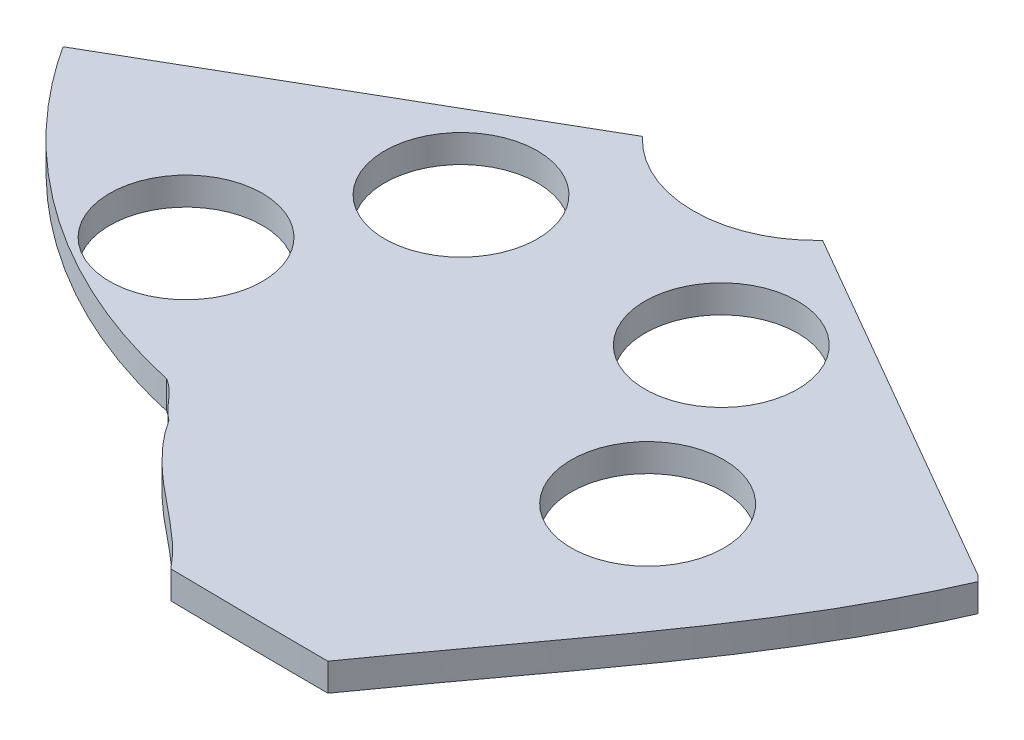
ISO-10303-21;
HEADER;
FILE_DESCRIPTION(('STEP AP214'),'2;1');
FILE_NAME('part.step','',(''),(''),'','','');
FILE_SCHEMA(('AUTOMOTIVE_DESIGN { 1 0 10303 214 1 1 1 1 }'));
ENDSEC;
DATA;
#1=APPLICATION_CONTEXT('core data for automotive mechanical design processes');
#2=APPLICATION_PROTOCOL_DEFINITION('international standard','automotive_design',2000,#1);
#3=PRODUCT_CONTEXT('',#1,'mechanical');
#4=PRODUCT('Part','Part','',(#3));
#5=PRODUCT_RELATED_PRODUCT_CATEGORY('part','',(#4));
#6=PRODUCT_DEFINITION_FORMATION('','',#4);
#7=PRODUCT_DEFINITION_CONTEXT('part definition',#1,'design');
#8=PRODUCT_DEFINITION('design','',#6,#7);
#9=PRODUCT_DEFINITION_SHAPE('','',#8);
#10=(LENGTH_UNIT() NAMED_UNIT(*) SI_UNIT(.MILLI.,.METRE.));
#11=(NAMED_UNIT(*) PLANE_ANGLE_UNIT() SI_UNIT($,.RADIAN.));
#12=(NAMED_UNIT(*) SI_UNIT($,.STERADIAN.) SOLID_ANGLE_UNIT());
#13=UNCERTAINTY_MEASURE_WITH_UNIT(LENGTH_MEASURE(1.E-05),#10,'distance_accuracy_value','');
#14=(GEOMETRIC_REPRESENTATION_CONTEXT(3) GLOBAL_UNCERTAINTY_ASSIGNED_CONTEXT((#13)) GLOBAL_UNIT_ASSIGNED_CONTEXT((#10,
#11,#12)) REPRESENTATION_CONTEXT('',''));
#15=CARTESIAN_POINT('',(0.,0.,0.));
#16=DIRECTION('',(0.,0.,1.));
#17=DIRECTION('',(1.,0.,0.));
#18=AXIS2_PLACEMENT_3D('',#15,#16,#17);
#19=CARTESIAN_POINT('',(-44.7870859446842,-67.7359999999999,64.4698967489232));
#20=DIRECTION('',(0.,-1.,0.));
#21=DIRECTION('',(0.,0.,-1.));
#22=AXIS2_PLACEMENT_3D('',#19,#20,#21);
#23=PLANE('',#22);
#24=CARTESIAN_POINT('',(18.75,-67.7359999999999,32.476));
#25=DIRECTION('',(0.,-1.,0.));
#26=DIRECTION('',(0.,0.,-1.));
#27=AXIS2_PLACEMENT_3D('',#24,#25,#26);
#28=CIRCLE('',#27,10.999845998306);
#29=CARTESIAN_POINT('',(18.75,-67.7359999999999,21.476154001694));
#30=VERTEX_POINT('',#29);
#31=EDGE_CURVE('E282',#30,#30,#28,.T.);
#32=ORIENTED_EDGE('',*,*,#31,.F.);
#33=EDGE_LOOP('',(#32));
#34=FACE_BOUND('',#33,.T.);
#35=CARTESIAN_POINT('',(-33.25,-67.7359999999999,57.591));
#36=DIRECTION('',(0.,-1.,0.));
#37=DIRECTION('',(0.,0.,-1.));
#38=AXIS2_PLACEMENT_3D('',#35,#36,#37);
#39=CIRCLE('',#38,10.999845998306);
#40=CARTESIAN_POINT('',(-33.25,-67.7359999999999,46.591154001694));
#41=VERTEX_POINT('',#40);
#42=EDGE_CURVE('E274',#41,#41,#39,.T.);
#43=ORIENTED_EDGE('',*,*,#42,.F.);
#44=EDGE_LOOP('',(#43));
#45=FACE_BOUND('',#44,.T.);
#46=CARTESIAN_POINT('',(-65.8942438215735,-67.7359999999999,42.6629141284689));
#47=CARTESIAN_POINT('',(-64.5103730944048,-67.7359999999999,44.7995838107321));
#48=CARTESIAN_POINT('',(-63.0231124482656,-67.7359999999999,46.870228375832));
#49=CARTESIAN_POINT('',(-59.8564174991639,-67.7359999999999,50.8527736003913));
#50=CARTESIAN_POINT('',(-58.1747067025662,-67.7359999999999,52.7674581947289));
#51=CARTESIAN_POINT('',(-52.8635790878858,-67.7359999999999,58.2541035728022));
#52=CARTESIAN_POINT('',(-48.9678495006857,-67.7359999999999,61.5656943039546));
#53=CARTESIAN_POINT('',(-40.6063223886827,-67.7359999999999,67.3740991938918));
#54=CARTESIAN_POINT('',(-36.1442743175034,-67.7359999999999,69.8695186681402));
#55=CARTESIAN_POINT('',(-26.815950297381,-67.7359999999999,73.9527834745407));
#56=CARTESIAN_POINT('',(-21.9559096805272,-67.7359999999999,75.5386255900114));
#57=CARTESIAN_POINT('',(-16.9859147236693,-67.7359999999999,76.6399162961217));
#58=B_SPLINE_CURVE_WITH_KNOTS('',3,(#46,#47,#48,#49,#50,#51,#52,#53,#54,#55,#56,#57),
.UNSPECIFIED.,.F.,.F.,(4,2,2,2,2,4),(1.33283993930533E-06,0.12500133283994,0.250001332839939,
0.50000133283994,0.75000133283994,1.),.UNSPECIFIED.);
#59=CARTESIAN_POINT('',(-16.9859147226186,-67.7359999999999,76.6399162913771));
#60=VERTEX_POINT('',#59);
#61=CARTESIAN_POINT('',(-65.8942438215735,-67.7359999999999,42.6629141284689));
#62=VERTEX_POINT('',#61);
#63=EDGE_CURVE('E446',#60,#62,#58,.F.);
#64=ORIENTED_EDGE('',*,*,#63,.T.);
#65=DIRECTION('',(0.866025113443951,0.,-0.500000502884139));
#66=VECTOR('',#65,1.);
#67=CARTESIAN_POINT('',(-65.8942438215735,-67.7359999999999,42.6629141284689));
#68=LINE('',#67,#66);
#69=CARTESIAN_POINT('',(-12.9766531358799,-67.7359999999999,12.1108879302399));
#70=VERTEX_POINT('',#69);
#71=EDGE_CURVE('E100',#62,#70,#68,.T.);
#72=ORIENTED_EDGE('',*,*,#71,.T.);
#73=CARTESIAN_POINT('',(0.,-67.7359999999999,0.));
#74=DIRECTION('',(0.,1.,0.));
#75=DIRECTION('',(0.,0.,-1.));
#76=AXIS2_PLACEMENT_3D('',#73,#74,#75);
#77=CIRCLE('',#76,17.7501305084715);
#78=CARTESIAN_POINT('',(12.9766531358511,-67.7359999999999,12.1108879302707));
#79=VERTEX_POINT('',#78);
#80=EDGE_CURVE('E263',#70,#79,#77,.T.);
#81=ORIENTED_EDGE('',*,*,#80,.T.);
#82=DIRECTION('',(0.866025113442778,0.,0.500000502886171));
#83=VECTOR('',#82,1.);
#84=CARTESIAN_POINT('',(12.9766531358511,-67.7359999999999,12.1108879302707));
#85=LINE('',#84,#83);
#86=CARTESIAN_POINT('',(65.8946490574661,-67.7359999999999,42.6631480920473));
#87=VERTEX_POINT('',#86);
#88=EDGE_CURVE('E257',#79,#87,#85,.T.);
#89=ORIENTED_EDGE('',*,*,#88,.T.);
#90=CARTESIAN_POINT('',(65.8946490574661,-67.7359999999999,42.6631480920473));
#91=CARTESIAN_POINT('',(66.1801065532165,-67.7359999999999,42.9413194010533));
#92=CARTESIAN_POINT('',(66.4632642301554,-67.7359999999999,43.2171523680039));
#93=CARTESIAN_POINT('',(66.7440215109314,-67.7359999999999,43.4907675784971));
#94=B_SPLINE_CURVE_WITH_KNOTS('',3,(#90,#91,#92,#93),.UNSPECIFIED.,.F.,.F.,(4,4),(0.,1.),.UNSPECIFIED.);
#95=CARTESIAN_POINT('',(66.7440215109314,-67.7359999999999,43.4907675784971));
#96=VERTEX_POINT('',#95);
#97=EDGE_CURVE('E232',#87,#96,#94,.T.);
#98=ORIENTED_EDGE('',*,*,#97,.T.);
#99=CARTESIAN_POINT('',(29.8437188807736,-67.7359999999999,100.248180586053));
#100=CARTESIAN_POINT('',(30.1403157004749,-67.7359999999999,99.828753181787));
#101=CARTESIAN_POINT('',(30.7407716473284,-67.7359999999999,98.9796285033145));
#102=CARTESIAN_POINT('',(31.8950181511044,-67.7359999999999,97.3589950207622));
#103=CARTESIAN_POINT('',(33.3461533176625,-67.7359999999999,95.3359010656423));
#104=CARTESIAN_POINT('',(35.6489327857828,-67.7359999999999,92.1550725160265));
#105=CARTESIAN_POINT('',(38.5688040539188,-67.7359999999999,88.1694898692489));
#106=CARTESIAN_POINT('',(41.480018200969,-67.7359999999999,84.2173305936617));
#107=CARTESIAN_POINT('',(43.8012890419734,-67.7359999999999,81.0499362964952));
#108=CARTESIAN_POINT('',(46.1124853023285,-67.7359999999999,77.8754755571248));
#109=CARTESIAN_POINT('',(48.9727685695331,-67.7359999999999,73.8886600115439));
#110=CARTESIAN_POINT('',(52.3273357815191,-67.7359999999999,69.0532698478011));
#111=CARTESIAN_POINT('',(55.0401692188045,-67.7359999999999,64.9503059498742));
#112=CARTESIAN_POINT('',(57.1307702870454,-67.7359999999999,61.6353610691958));
#113=CARTESIAN_POINT('',(58.6653179713874,-67.7359999999999,59.114608423476));
#114=CARTESIAN_POINT('',(60.1422061459481,-67.7359999999999,56.592290953136));
#115=CARTESIAN_POINT('',(61.280598216444,-67.7359999999999,54.5621578646775));
#116=CARTESIAN_POINT('',(62.0919371809747,-67.7359999999999,53.0676951689367));
#117=CARTESIAN_POINT('',(62.6069171423795,-67.7359999999999,52.101405018029));
#118=CARTESIAN_POINT('',(63.1112142660139,-67.7359999999999,51.1368352527422));
#119=CARTESIAN_POINT('',(63.6046687912201,-67.7359999999999,50.174087458305));
#120=CARTESIAN_POINT('',(64.0871307052581,-67.7359999999999,49.2132579069561));
#121=CARTESIAN_POINT('',(64.5584710311557,-67.7359999999999,48.2544417907281));
#122=CARTESIAN_POINT('',(65.0185540094539,-67.7359999999999,47.2977214719384));
#123=CARTESIAN_POINT('',(65.4673349282958,-67.7359999999999,46.3432084067217));
#124=CARTESIAN_POINT('',(65.9044989688588,-67.7359999999999,45.3908872480931));
#125=CARTESIAN_POINT('',(66.3307956340191,-67.7359999999999,44.4411917795238));
#126=CARTESIAN_POINT('',(66.6065853916122,-67.7359999999999,43.8068722347587));
#127=CARTESIAN_POINT('',(66.7440215218718,-67.7359999999999,43.4907675891717));
#128=B_SPLINE_CURVE_WITH_KNOTS('',3,(#99,#100,#101,#102,#103,#104,#105,#106,#107,#108,#109,#110,
#111,#112,#113,#114,#115,#116,#117,#118,#119,#120,#121,#122,#123,#124,#125,#126,#127),
.UNSPECIFIED.,.F.,.F.,(4,1,1,1,1,1,1,1,1,1,1,1,1,1,1,1,1,1,1,1,1,1,1,1,1,1,4),(0.,
0.0227157028356554,0.0459876099425524,0.0879819245551136,0.13281001264998,0.219632921638901,
0.306457076403063,0.349868689179429,0.393279780913662,0.480093699810902,0.566836641967887,
0.653501674848487,0.697571248401288,0.740132527495501,0.783992907878297,0.826813718170624,
0.843047956754735,0.859187815372855,0.875231666227044,0.891178118299632,0.907025976411927,
0.922774239928346,0.938422100991825,0.953968942316556,0.969414337866838,0.984758045107651,1.),.UNSPECIFIED.);
#129=CARTESIAN_POINT('',(29.8437188807736,-67.7359999999999,100.248180586053));
#130=VERTEX_POINT('',#129);
#131=EDGE_CURVE('E123',#96,#130,#128,.F.);
#132=ORIENTED_EDGE('',*,*,#131,.T.);
#133=CARTESIAN_POINT('',(29.8437548988785,-67.7359999999999,100.248180387592));
#134=CARTESIAN_POINT('',(22.6769169848528,-67.7359999999999,100.287743676472));
#135=CARTESIAN_POINT('',(15.0122740911258,-67.7359999999999,100.114292594177));
#136=CARTESIAN_POINT('',(7.01359173730503,-67.7359999999999,100.036279356633));
#137=B_SPLINE_CURVE_WITH_KNOTS('',3,(#133,#134,#135,#136),.UNSPECIFIED.,.F.,.F.,(4,4),(0.,1.),.UNSPECIFIED.);
#138=CARTESIAN_POINT('',(7.01359173730503,-67.7359999999999,100.036279356633));
#139=VERTEX_POINT('',#138);
#140=EDGE_CURVE('E116',#130,#139,#137,.T.);
#141=ORIENTED_EDGE('',*,*,#140,.T.);
#142=CARTESIAN_POINT('',(-11.6293824871223,-67.736,81.6755992516973));
#143=CARTESIAN_POINT('',(-11.5737425995266,-67.736,81.7629343796846));
#144=CARTESIAN_POINT('',(-11.3131403871373,-67.736,82.1719907333923));
#145=CARTESIAN_POINT('',(-10.8110290264511,-67.7359999999999,82.9062930253016));
#146=CARTESIAN_POINT('',(-9.87531122790049,-67.7359999999999,84.1601083605932));
#147=CARTESIAN_POINT('',(-8.61160455603236,-67.7359999999999,85.6579236494982));
#148=CARTESIAN_POINT('',(-7.26548228353772,-67.7359999999999,87.0577824462961));
#149=CARTESIAN_POINT('',(-6.14778207271069,-67.7359999999999,88.1319112799531));
#150=CARTESIAN_POINT('',(-5.00507725374255,-67.7359999999999,89.1807237276031));
#151=CARTESIAN_POINT('',(-3.53694203129043,-67.7359999999999,90.4508476372666));
#152=CARTESIAN_POINT('',(-1.73709072592609,-67.7359999999999,91.9325947296244));
#153=CARTESIAN_POINT('',(0.0754397038429127,-67.7359999999999,93.4005965514735));
#154=CARTESIAN_POINT('',(1.87248135152671,-67.7359999999999,94.8852674683476));
#155=CARTESIAN_POINT('',(3.44759358913644,-67.7359999999999,96.266119679191));
#156=CARTESIAN_POINT('',(4.77398734546979,-67.7359999999999,97.5326759971414));
#157=CARTESIAN_POINT('',(5.84838835133482,-67.7359999999999,98.6535488318008));
#158=CARTESIAN_POINT('',(6.57792395724219,-67.7359999999999,99.4934942826784));
#159=CARTESIAN_POINT('',(6.95051888800939,-67.7359999999999,99.9577107190432));
#160=CARTESIAN_POINT('',(7.01358496649672,-67.7359999999999,100.036284791102));
#161=B_SPLINE_CURVE_WITH_KNOTS('',3,(#142,#143,#144,#145,#146,#147,#148,#149,#150,#151,#152,
#153,#154,#155,#156,#157,#158,#159,#160),.UNSPECIFIED.,.F.,.F.,(4,1,1,1,1,1,1,1,1,1,1,1,1,1,1,1,
4),(-2.70658933265722E-07,0.0118277018035376,0.055398969802556,0.101565598992885,
0.190484555528971,0.279022579901435,0.323268635205543,0.367534249622184,0.456173794315668,
0.544964249444377,0.633814620759511,0.722591773003938,0.811206246834848,0.873007032070253,
0.932013626831285,0.988495942236272,1.00000413375592),.UNSPECIFIED.);
#162=CARTESIAN_POINT('',(-11.6293824871223,-67.7359999999999,81.6755992516973));
#163=VERTEX_POINT('',#162);
#164=EDGE_CURVE('E120',#139,#163,#161,.F.);
#165=ORIENTED_EDGE('',*,*,#164,.T.);
#166=CARTESIAN_POINT('',(-16.9859147226186,-67.7359999999999,76.6399162913771));
#167=CARTESIAN_POINT('',(-16.92412669874,-67.7359999999999,76.6790819043911));
#168=CARTESIAN_POINT('',(-16.8063461718812,-67.7359999999999,76.7537395199929));
#169=CARTESIAN_POINT('',(-16.5611305774708,-67.7359999999999,76.9182426639113));
#170=CARTESIAN_POINT('',(-16.1291727934494,-67.7359999999999,77.2295637088581));
#171=CARTESIAN_POINT('',(-15.532992148909,-67.7359999999999,77.7288547684759));
#172=CARTESIAN_POINT('',(-14.8712605942748,-67.7359999999999,78.386841510728));
#173=CARTESIAN_POINT('',(-14.3515919393694,-67.7359999999999,78.9665925946479));
#174=CARTESIAN_POINT('',(-13.9410660004133,-67.7359999999999,79.4367046744693));
#175=CARTESIAN_POINT('',(-13.5290741447922,-67.7359999999999,79.9062752961094));
#176=CARTESIAN_POINT('',(-13.0027447575765,-67.7359999999999,80.4827028740064));
#177=CARTESIAN_POINT('',(-12.4400262300641,-67.7359999999999,81.0241130975552));
#178=CARTESIAN_POINT('',(-12.0314414154114,-67.7359999999999,81.3674007983877));
#179=CARTESIAN_POINT('',(-11.7995239402494,-67.7359999999999,81.5492448039049));
#180=CARTESIAN_POINT('',(-11.6880222397685,-67.7359999999999,81.6320514661815));
#181=CARTESIAN_POINT('',(-11.6293824871226,-67.7359999999999,81.6755992516976));
#182=B_SPLINE_CURVE_WITH_KNOTS('',3,(#166,#167,#168,#169,#170,#171,#172,#173,#174,#175,#176,
#177,#178,#179,#180,#181),.UNSPECIFIED.,.F.,.F.,(4,1,1,1,1,1,1,1,1,1,1,1,1,4),
(2.34221490162945E-05,0.0297735146203462,0.0567331426646225,0.120099842966942,0.246240096109832,
0.37248646038271,0.499289156751347,0.56280346873172,0.626315954972162,0.753343786552148,
0.880157282408044,0.943518910088665,0.97029632693346,1.),.UNSPECIFIED.);
#183=EDGE_CURVE('E51',#163,#60,#182,.F.);
#184=ORIENTED_EDGE('',*,*,#183,.T.);
#185=EDGE_LOOP('',(#64,#72,#81,#89,#98,#132,#141,#165,#184));
#186=FACE_BOUND('',#185,.T.);
#187=CARTESIAN_POINT('',(33.25,-67.7359999999999,57.591));
#188=DIRECTION('',(0.,-1.,0.));
#189=DIRECTION('',(0.,0.,-1.));
#190=AXIS2_PLACEMENT_3D('',#187,#188,#189);
#191=CIRCLE('',#190,10.999845998306);
#192=CARTESIAN_POINT('',(33.25,-67.7359999999999,46.591154001694));
#193=VERTEX_POINT('',#192);
#194=EDGE_CURVE('E275',#193,#193,#191,.T.);
#195=ORIENTED_EDGE('',*,*,#194,.F.);
#196=EDGE_LOOP('',(#195));
#197=FACE_BOUND('',#196,.T.);
#198=CARTESIAN_POINT('',(-18.75,-67.7359999999999,32.476));
#199=DIRECTION('',(0.,-1.,0.));
#200=DIRECTION('',(0.,0.,-1.));
#201=AXIS2_PLACEMENT_3D('',#198,#199,#200);
#202=CIRCLE('',#201,10.999845998306);
#203=CARTESIAN_POINT('',(-18.75,-67.7359999999999,21.476154001694));
#204=VERTEX_POINT('',#203);
#205=EDGE_CURVE('E288',#204,#204,#202,.T.);
#206=ORIENTED_EDGE('',*,*,#205,.F.);
#207=EDGE_LOOP('',(#206));
#208=FACE_BOUND('',#207,.T.);
#209=ADVANCED_FACE('F30',(#34,#45,#186,#197,#208),#23,.T.);
#210=CARTESIAN_POINT('',(-44.7870859446842,-63.7359999999999,64.4698967489232));
#211=DIRECTION('',(0.,-1.,0.));
#212=DIRECTION('',(0.,0.,-1.));
#213=AXIS2_PLACEMENT_3D('',#210,#211,#212);
#214=PLANE('',#213);
#215=CARTESIAN_POINT('',(18.75,-63.7359999999999,32.476));
#216=DIRECTION('',(0.,-1.,0.));
#217=DIRECTION('',(0.,0.,-1.));
#218=AXIS2_PLACEMENT_3D('',#215,#216,#217);
#219=CIRCLE('',#218,10.999845998306);
#220=CARTESIAN_POINT('',(18.75,-63.7359999999999,21.476154001694));
#221=VERTEX_POINT('',#220);
#222=EDGE_CURVE('E285',#221,#221,#219,.T.);
#223=ORIENTED_EDGE('',*,*,#222,.T.);
#224=EDGE_LOOP('',(#223));
#225=FACE_BOUND('',#224,.T.);
#226=CARTESIAN_POINT('',(-33.25,-63.7359999999999,57.591));
#227=DIRECTION('',(0.,-1.,0.));
#228=DIRECTION('',(0.,0.,-1.));
#229=AXIS2_PLACEMENT_3D('',#226,#227,#228);
#230=CIRCLE('',#229,10.999845998306);
#231=CARTESIAN_POINT('',(-33.25,-63.7359999999999,46.591154001694));
#232=VERTEX_POINT('',#231);
#233=EDGE_CURVE('E268',#232,#232,#230,.T.);
#234=ORIENTED_EDGE('',*,*,#233,.T.);
#235=EDGE_LOOP('',(#234));
#236=FACE_BOUND('',#235,.T.);
#237=CARTESIAN_POINT('',(-16.9859147236693,-63.7359999999999,76.6399162961217));
#238=CARTESIAN_POINT('',(-21.9559096805272,-63.7359999999999,75.5386255900114));
#239=CARTESIAN_POINT('',(-26.815950297381,-63.7359999999999,73.9527834745407));
#240=CARTESIAN_POINT('',(-36.1442743175034,-63.7359999999999,69.8695186681402));
#241=CARTESIAN_POINT('',(-40.6063223886827,-63.7359999999999,67.3740991938918));
#242=CARTESIAN_POINT('',(-48.9678495006857,-63.7359999999999,61.5656943039546));
#243=CARTESIAN_POINT('',(-52.8635790878858,-63.7359999999999,58.2541035728022));
#244=CARTESIAN_POINT('',(-58.1747067025662,-63.7359999999999,52.7674581947289));
#245=CARTESIAN_POINT('',(-59.8564174991639,-63.7359999999999,50.8527736003913));
#246=CARTESIAN_POINT('',(-63.0231124482656,-63.7359999999999,46.870228375832));
#247=CARTESIAN_POINT('',(-64.5103730944048,-63.7359999999999,44.7995838107321));
#248=CARTESIAN_POINT('',(-65.8942438215735,-63.7359999999999,42.6629141284689));
#249=B_SPLINE_CURVE_WITH_KNOTS('',3,(#237,#238,#239,#240,#241,#242,#243,#244,#245,#246,#247,
#248),.UNSPECIFIED.,.F.,.F.,(4,2,2,2,2,4),(1.3328399393812E-06,0.25,0.5,0.75,0.875,1.),.UNSPECIFIED.);
#250=CARTESIAN_POINT('',(-16.9859147226186,-63.7359999999999,76.6399162913771));
#251=VERTEX_POINT('',#250);
#252=CARTESIAN_POINT('',(-65.8942438215735,-63.7359999999999,42.6629141284689));
#253=VERTEX_POINT('',#252);
#254=EDGE_CURVE('E278',#251,#253,#249,.T.);
#255=ORIENTED_EDGE('',*,*,#254,.F.);
#256=CARTESIAN_POINT('',(-11.6293824871226,-63.7359999999999,81.6755992516976));
#257=CARTESIAN_POINT('',(-11.6880222397685,-63.7359999999999,81.6320514661815));
#258=CARTESIAN_POINT('',(-11.7995239402494,-63.7359999999999,81.5492448039049));
#259=CARTESIAN_POINT('',(-12.0314414154114,-63.7359999999999,81.3674007983877));
#260=CARTESIAN_POINT('',(-12.4400262300641,-63.7359999999999,81.0241130975552));
#261=CARTESIAN_POINT('',(-13.0027447575765,-63.7359999999999,80.4827028740064));
#262=CARTESIAN_POINT('',(-13.5290741447922,-63.7359999999999,79.9062752961094));
#263=CARTESIAN_POINT('',(-13.9410660004133,-63.7359999999999,79.4367046744693));
#264=CARTESIAN_POINT('',(-14.3515919393694,-63.7359999999999,78.9665925946479));
#265=CARTESIAN_POINT('',(-14.8712605942748,-63.7359999999999,78.386841510728));
#266=CARTESIAN_POINT('',(-15.532992148909,-63.7359999999999,77.7288547684759));
#267=CARTESIAN_POINT('',(-16.1291727934494,-63.7359999999999,77.2295637088581));
#268=CARTESIAN_POINT('',(-16.5611305774708,-63.7359999999999,76.9182426639113));
#269=CARTESIAN_POINT('',(-16.8063461718812,-63.7359999999999,76.7537395199929));
#270=CARTESIAN_POINT('',(-16.92412669874,-63.7359999999999,76.6790819043911));
#271=CARTESIAN_POINT('',(-16.9859147226186,-63.7359999999999,76.6399162913771));
#272=B_SPLINE_CURVE_WITH_KNOTS('',3,(#256,#257,#258,#259,#260,#261,#262,#263,#264,#265,#266,
#267,#268,#269,#270,#271),.UNSPECIFIED.,.F.,.F.,(4,1,1,1,1,1,1,1,1,1,1,1,1,4),
(2.34221490162242E-05,0.0297270952155559,0.0565045120603515,0.119866139740972,0.246679635596869,
0.373707467176854,0.437219953417296,0.500734265397669,0.627536961766306,0.753783326039185,
0.879923579182074,0.943290279484394,0.97024990752867,1.),.UNSPECIFIED.);
#273=CARTESIAN_POINT('',(-11.6293824871223,-63.7359999999999,81.6755992516973));
#274=VERTEX_POINT('',#273);
#275=EDGE_CURVE('E91',#274,#251,#272,.T.);
#276=ORIENTED_EDGE('',*,*,#275,.F.);
#277=CARTESIAN_POINT('',(7.01358496649672,-63.736,100.036284791102));
#278=CARTESIAN_POINT('',(6.95051888800939,-63.736,99.9577107190432));
#279=CARTESIAN_POINT('',(6.57792395724219,-63.736,99.4934942826784));
#280=CARTESIAN_POINT('',(5.84838835133482,-63.736,98.6535488318008));
#281=CARTESIAN_POINT('',(4.77398734546979,-63.736,97.5326759971414));
#282=CARTESIAN_POINT('',(3.44759358913644,-63.736,96.266119679191));
#283=CARTESIAN_POINT('',(1.87248135152671,-63.736,94.8852674683476));
#284=CARTESIAN_POINT('',(0.0754397038429127,-63.736,93.4005965514735));
#285=CARTESIAN_POINT('',(-1.73709072592609,-63.736,91.9325947296244));
#286=CARTESIAN_POINT('',(-3.53694203129043,-63.736,90.4508476372666));
#287=CARTESIAN_POINT('',(-5.00507725374255,-63.736,89.1807237276031));
#288=CARTESIAN_POINT('',(-6.14778207271069,-63.736,88.1319112799531));
#289=CARTESIAN_POINT('',(-7.26548228353772,-63.736,87.0577824462961));
#290=CARTESIAN_POINT('',(-8.61160455603236,-63.736,85.6579236494982));
#291=CARTESIAN_POINT('',(-9.87531122790049,-63.736,84.1601083605932));
#292=CARTESIAN_POINT('',(-10.8110290264511,-63.736,82.9062930253016));
#293=CARTESIAN_POINT('',(-11.3131403871373,-63.736,82.1719907333923));
#294=CARTESIAN_POINT('',(-11.5737425995266,-63.736,81.7629343796846));
#295=CARTESIAN_POINT('',(-11.6293824871223,-63.736,81.6755992516973));
#296=B_SPLINE_CURVE_WITH_KNOTS('',3,(#277,#278,#279,#280,#281,#282,#283,#284,#285,#286,#287,
#288,#289,#290,#291,#292,#293,#294,#295),.UNSPECIFIED.,.F.,.F.,(4,1,1,1,1,1,1,1,1,1,1,1,1,1,1,1,
4),(-2.70658933273122E-07,0.0115079208607162,0.0679902362657033,0.126996831026736,
0.188797616262141,0.277412090093051,0.366189242337477,0.455039613652612,0.54383006878132,
0.632469613474804,0.676735227891445,0.720981283195553,0.809519307568018,0.898438264104104,
0.944604893294432,0.988176161293451,1.00000413375592),.UNSPECIFIED.);
#297=CARTESIAN_POINT('',(7.01359173730503,-63.7359999999999,100.036279356633));
#298=VERTEX_POINT('',#297);
#299=EDGE_CURVE('E84',#298,#274,#296,.T.);
#300=ORIENTED_EDGE('',*,*,#299,.F.);
#301=CARTESIAN_POINT('',(29.8437548988785,-63.7359999999999,100.248180387592));
#302=CARTESIAN_POINT('',(22.6769169848528,-63.7359999999999,100.287743676472));
#303=CARTESIAN_POINT('',(15.0122740911258,-63.7359999999999,100.114292594177));
#304=CARTESIAN_POINT('',(7.01359173730503,-63.7359999999999,100.036279356633));
#305=B_SPLINE_CURVE_WITH_KNOTS('',3,(#301,#302,#303,#304),.UNSPECIFIED.,.F.,.F.,(4,4),(0.,1.),.UNSPECIFIED.);
#306=CARTESIAN_POINT('',(29.8437188807736,-63.7359999999999,100.248180586053));
#307=VERTEX_POINT('',#306);
#308=EDGE_CURVE('E132',#307,#298,#305,.T.);
#309=ORIENTED_EDGE('',*,*,#308,.F.);
#310=CARTESIAN_POINT('',(66.7440215218718,-63.7359999999999,43.4907675891717));
#311=CARTESIAN_POINT('',(66.6065853916122,-63.7359999999999,43.8068722347587));
#312=CARTESIAN_POINT('',(66.3307956340191,-63.7359999999999,44.4411917795238));
#313=CARTESIAN_POINT('',(65.9044989688588,-63.7359999999999,45.3908872480931));
#314=CARTESIAN_POINT('',(65.4673349282958,-63.7359999999999,46.3432084067217));
#315=CARTESIAN_POINT('',(65.0185540094539,-63.7359999999999,47.2977214719384));
#316=CARTESIAN_POINT('',(64.5584710311557,-63.7359999999999,48.2544417907281));
#317=CARTESIAN_POINT('',(64.0871307052581,-63.7359999999999,49.2132579069561));
#318=CARTESIAN_POINT('',(63.6046687912201,-63.7359999999999,50.174087458305));
#319=CARTESIAN_POINT('',(63.1112142660139,-63.7359999999999,51.1368352527422));
#320=CARTESIAN_POINT('',(62.6069171423795,-63.7359999999999,52.101405018029));
#321=CARTESIAN_POINT('',(62.0919371809747,-63.7359999999999,53.0676951689367));
#322=CARTESIAN_POINT('',(61.280598216444,-63.7359999999999,54.5621578646775));
#323=CARTESIAN_POINT('',(60.1422061459481,-63.7359999999999,56.592290953136));
#324=CARTESIAN_POINT('',(58.6653179713874,-63.7359999999999,59.114608423476));
#325=CARTESIAN_POINT('',(57.1307702870454,-63.7359999999999,61.6353610691958));
#326=CARTESIAN_POINT('',(55.0401692188045,-63.7359999999999,64.9503059498742));
#327=CARTESIAN_POINT('',(52.3273357815191,-63.7359999999999,69.0532698478011));
#328=CARTESIAN_POINT('',(48.9727685695331,-63.7359999999999,73.8886600115439));
#329=CARTESIAN_POINT('',(46.1124853023285,-63.7359999999999,77.8754755571248));
#330=CARTESIAN_POINT('',(43.8012890419734,-63.7359999999999,81.0499362964952));
#331=CARTESIAN_POINT('',(41.480018200969,-63.7359999999999,84.2173305936617));
#332=CARTESIAN_POINT('',(38.5688040539188,-63.7359999999999,88.1694898692489));
#333=CARTESIAN_POINT('',(35.6489327857828,-63.7359999999999,92.1550725160265));
#334=CARTESIAN_POINT('',(33.3461533176625,-63.7359999999999,95.3359010656423));
#335=CARTESIAN_POINT('',(31.8950181511044,-63.7359999999999,97.3589950207622));
#336=CARTESIAN_POINT('',(30.7407716473284,-63.7359999999999,98.9796285033145));
#337=CARTESIAN_POINT('',(30.1403157004749,-63.7359999999999,99.828753181787));
#338=CARTESIAN_POINT('',(29.8437188807736,-63.7359999999999,100.248180586053));
#339=B_SPLINE_CURVE_WITH_KNOTS('',3,(#310,#311,#312,#313,#314,#315,#316,#317,#318,#319,#320,
#321,#322,#323,#324,#325,#326,#327,#328,#329,#330,#331,#332,#333,#334,#335,#336,#337,#338),
.UNSPECIFIED.,.F.,.F.,(4,1,1,1,1,1,1,1,1,1,1,1,1,1,1,1,1,1,1,1,1,1,1,1,1,1,4),(0.,
0.0152419548923492,0.0305856621331616,0.0460310576834438,0.0615778990081748,0.0772257600716542,
0.0929740235880728,0.108821881700368,0.124768333772956,0.140812184627145,0.156952043245265,
0.173186281829376,0.216007092121703,0.259867472504499,0.302428751598712,0.346498325151513,
0.433163358032113,0.519906300189098,0.606720219086338,0.650131310820571,0.693542923596937,
0.780367078361099,0.86718998735002,0.912018075444886,0.954012390057448,0.977284297164345,1.),.UNSPECIFIED.);
#340=CARTESIAN_POINT('',(66.7440215109314,-63.7359999999999,43.4907675784971));
#341=VERTEX_POINT('',#340);
#342=EDGE_CURVE('E499',#341,#307,#339,.T.);
#343=ORIENTED_EDGE('',*,*,#342,.F.);
#344=CARTESIAN_POINT('',(65.8946490574661,-63.7359999999999,42.6631480920473));
#345=CARTESIAN_POINT('',(66.1801065532165,-63.7359999999999,42.9413194010533));
#346=CARTESIAN_POINT('',(66.4632642301554,-63.7359999999999,43.2171523680039));
#347=CARTESIAN_POINT('',(66.7440215109314,-63.7359999999999,43.4907675784971));
#348=B_SPLINE_CURVE_WITH_KNOTS('',3,(#344,#345,#346,#347),.UNSPECIFIED.,.F.,.F.,(4,4),(0.,1.),.UNSPECIFIED.);
#349=CARTESIAN_POINT('',(65.8946490574661,-63.7359999999999,42.6631480920473));
#350=VERTEX_POINT('',#349);
#351=EDGE_CURVE('E185',#350,#341,#348,.T.);
#352=ORIENTED_EDGE('',*,*,#351,.F.);
#353=DIRECTION('',(0.866025113442778,0.,0.500000502886171));
#354=VECTOR('',#353,1.);
#355=CARTESIAN_POINT('',(12.9766531358511,-63.7359999999999,12.1108879302707));
#356=LINE('',#355,#354);
#357=CARTESIAN_POINT('',(12.9766531358511,-63.7359999999999,12.1108879302707));
#358=VERTEX_POINT('',#357);
#359=EDGE_CURVE('E182',#358,#350,#356,.T.);
#360=ORIENTED_EDGE('',*,*,#359,.F.);
#361=CARTESIAN_POINT('',(0.,-63.7359999999999,0.));
#362=DIRECTION('',(0.,1.,0.));
#363=DIRECTION('',(0.,0.,-1.));
#364=AXIS2_PLACEMENT_3D('',#361,#362,#363);
#365=CIRCLE('',#364,17.7501305084715);
#366=CARTESIAN_POINT('',(-12.9766531358799,-63.7359999999999,12.1108879302399));
#367=VERTEX_POINT('',#366);
#368=EDGE_CURVE('E177',#367,#358,#365,.T.);
#369=ORIENTED_EDGE('',*,*,#368,.F.);
#370=DIRECTION('',(0.866025113443951,0.,-0.500000502884139));
#371=VECTOR('',#370,1.);
#372=CARTESIAN_POINT('',(-65.8942438215735,-63.7359999999999,42.6629141284689));
#373=LINE('',#372,#371);
#374=EDGE_CURVE('E183',#253,#367,#373,.T.);
#375=ORIENTED_EDGE('',*,*,#374,.F.);
#376=EDGE_LOOP('',(#255,#276,#300,#309,#343,#352,#360,#369,#375));
#377=FACE_BOUND('',#376,.T.);
#378=CARTESIAN_POINT('',(33.25,-63.7359999999999,57.591));
#379=DIRECTION('',(0.,-1.,0.));
#380=DIRECTION('',(0.,0.,-1.));
#381=AXIS2_PLACEMENT_3D('',#378,#379,#380);
#382=CIRCLE('',#381,10.999845998306);
#383=CARTESIAN_POINT('',(33.25,-63.7359999999999,46.591154001694));
#384=VERTEX_POINT('',#383);
#385=EDGE_CURVE('E279',#384,#384,#382,.T.);
#386=ORIENTED_EDGE('',*,*,#385,.T.);
#387=EDGE_LOOP('',(#386));
#388=FACE_BOUND('',#387,.T.);
#389=CARTESIAN_POINT('',(-18.75,-63.7359999999999,32.476));
#390=DIRECTION('',(0.,-1.,0.));
#391=DIRECTION('',(0.,0.,-1.));
#392=AXIS2_PLACEMENT_3D('',#389,#390,#391);
#393=CIRCLE('',#392,10.999845998306);
#394=CARTESIAN_POINT('',(-18.75,-63.7359999999999,21.476154001694));
#395=VERTEX_POINT('',#394);
#396=EDGE_CURVE('E291',#395,#395,#393,.T.);
#397=ORIENTED_EDGE('',*,*,#396,.T.);
#398=EDGE_LOOP('',(#397));
#399=FACE_BOUND('',#398,.T.);
#400=ADVANCED_FACE('F207',(#225,#236,#377,#388,#399),#214,.F.);
#401=CARTESIAN_POINT('',(-16.9858352327428,-67.7359999999999,76.6399339103051));
#402=CARTESIAN_POINT('',(-21.9558578589954,-67.7359999999999,75.5386424994783));
#403=CARTESIAN_POINT('',(-26.8159254309891,-67.7359999999999,73.9527943592466));
#404=CARTESIAN_POINT('',(-36.1442743175034,-67.7359999999999,69.8695186681402));
#405=CARTESIAN_POINT('',(-40.6063223886827,-67.7359999999999,67.3740991938918));
#406=CARTESIAN_POINT('',(-48.9678495006857,-67.7359999999999,61.5656943039546));
#407=CARTESIAN_POINT('',(-52.8635790878858,-67.7359999999999,58.2541035728022));
#408=CARTESIAN_POINT('',(-58.1747067025662,-67.7359999999999,52.7674581947289));
#409=CARTESIAN_POINT('',(-59.8564174991639,-67.7359999999999,50.8527736003913));
#410=CARTESIAN_POINT('',(-63.0231124482656,-67.7359999999999,46.870228375832));
#411=CARTESIAN_POINT('',(-64.5103730944048,-67.7359999999999,44.7995838107321));
#412=CARTESIAN_POINT('',(-65.8942438215735,-67.7359999999999,42.6629141284689));
#413=B_SPLINE_CURVE_WITH_KNOTS('',3,(#401,#402,#403,#404,#405,#406,#407,#408,#409,#410,#411,
#412),.UNSPECIFIED.,.F.,.F.,(4,2,2,2,2,4),(0.,0.25,0.5,0.75,0.875,1.),.UNSPECIFIED.);
#414=DIRECTION('',(0.,1.,0.));
#415=VECTOR('',#414,1.);
#416=SURFACE_OF_LINEAR_EXTRUSION('',#413,#415);
#417=ORIENTED_EDGE('',*,*,#254,.T.);
#418=DIRECTION('',(0.,1.,0.));
#419=VECTOR('',#418,1.);
#420=CARTESIAN_POINT('',(-65.8942438215735,-67.7359999999999,42.6629141284689));
#421=LINE('',#420,#419);
#422=EDGE_CURVE('E11',#62,#253,#421,.T.);
#423=ORIENTED_EDGE('',*,*,#422,.F.);
#424=ORIENTED_EDGE('',*,*,#63,.F.);
#425=DIRECTION('',(0.,1.,0.));
#426=VECTOR('',#425,1.);
#427=CARTESIAN_POINT('',(-16.9859147226186,-67.7359999999999,76.6399162913771));
#428=LINE('',#427,#426);
#429=EDGE_CURVE('E474',#60,#251,#428,.T.);
#430=ORIENTED_EDGE('',*,*,#429,.T.);
#431=EDGE_LOOP('',(#417,#423,#424,#430));
#432=FACE_BOUND('',#431,.T.);
#433=ADVANCED_FACE('F32',(#432),#416,.F.);
#434=CARTESIAN_POINT('',(-65.8942438215735,-67.7359999999999,42.6629141284689));
#435=DIRECTION('',(0.500000502884139,0.,0.866025113443951));
#436=DIRECTION('',(0.866025113443951,0.,-0.500000502884139));
#437=AXIS2_PLACEMENT_3D('',#434,#435,#436);
#438=PLANE('',#437);
#439=ORIENTED_EDGE('',*,*,#374,.T.);
#440=DIRECTION('',(0.,1.,0.));
#441=VECTOR('',#440,1.);
#442=CARTESIAN_POINT('',(-12.9766531358799,-67.7359999999999,12.1108879302399));
#443=LINE('',#442,#441);
#444=EDGE_CURVE('E42',#70,#367,#443,.T.);
#445=ORIENTED_EDGE('',*,*,#444,.F.);
#446=ORIENTED_EDGE('',*,*,#71,.F.);
#447=ORIENTED_EDGE('',*,*,#422,.T.);
#448=EDGE_LOOP('',(#439,#445,#446,#447));
#449=FACE_BOUND('',#448,.T.);
#450=ADVANCED_FACE('F310',(#449),#438,.F.);
#451=CARTESIAN_POINT('',(0.,-67.7359999999999,0.));
#452=DIRECTION('',(0.,1.,0.));
#453=DIRECTION('',(0.,0.,1.));
#454=AXIS2_PLACEMENT_3D('',#451,#452,#453);
#455=CYLINDRICAL_SURFACE('',#454,17.7501305084715);
#456=ORIENTED_EDGE('',*,*,#368,.T.);
#457=DIRECTION('',(0.,1.,0.));
#458=VECTOR('',#457,1.);
#459=CARTESIAN_POINT('',(12.9766531358511,-67.7359999999999,12.1108879302707));
#460=LINE('',#459,#458);
#461=EDGE_CURVE('E189',#79,#358,#460,.T.);
#462=ORIENTED_EDGE('',*,*,#461,.F.);
#463=ORIENTED_EDGE('',*,*,#80,.F.);
#464=ORIENTED_EDGE('',*,*,#444,.T.);
#465=EDGE_LOOP('',(#456,#462,#463,#464));
#466=FACE_BOUND('',#465,.T.);
#467=ADVANCED_FACE('F372',(#466),#455,.F.);
#468=CARTESIAN_POINT('',(12.9766531358511,-67.7359999999999,12.1108879302707));
#469=DIRECTION('',(-0.500000502886171,0.,0.866025113442778));
#470=DIRECTION('',(0.866025113442778,0.,0.500000502886171));
#471=AXIS2_PLACEMENT_3D('',#468,#469,#470);
#472=PLANE('',#471);
#473=ORIENTED_EDGE('',*,*,#359,.T.);
#474=DIRECTION('',(0.,1.,0.));
#475=VECTOR('',#474,1.);
#476=CARTESIAN_POINT('',(65.8946490574661,-67.7359999999999,42.6631480920473));
#477=LINE('',#476,#475);
#478=EDGE_CURVE('E186',#87,#350,#477,.T.);
#479=ORIENTED_EDGE('',*,*,#478,.F.);
#480=ORIENTED_EDGE('',*,*,#88,.F.);
#481=ORIENTED_EDGE('',*,*,#461,.T.);
#482=EDGE_LOOP('',(#473,#479,#480,#481));
#483=FACE_BOUND('',#482,.T.);
#484=ADVANCED_FACE('F364',(#483),#472,.F.);
#485=DIRECTION('',(0.,1.,0.));
#486=VECTOR('',#485,1.);
#487=SURFACE_OF_LINEAR_EXTRUSION('',#94,#486);
#488=ORIENTED_EDGE('',*,*,#351,.T.);
#489=DIRECTION('',(0.,1.,0.));
#490=VECTOR('',#489,1.);
#491=CARTESIAN_POINT('',(66.7440215109314,-67.7359999999999,43.4907675784971));
#492=LINE('',#491,#490);
#493=EDGE_CURVE('E190',#96,#341,#492,.T.);
#494=ORIENTED_EDGE('',*,*,#493,.F.);
#495=ORIENTED_EDGE('',*,*,#97,.F.);
#496=ORIENTED_EDGE('',*,*,#478,.T.);
#497=EDGE_LOOP('',(#488,#494,#495,#496));
#498=FACE_BOUND('',#497,.T.);
#499=ADVANCED_FACE('F244',(#498),#487,.F.);
#500=CARTESIAN_POINT('',(66.7440215218718,-67.7359999999999,43.4907675891717));
#501=CARTESIAN_POINT('',(66.6065853916122,-67.7359999999999,43.8068722347587));
#502=CARTESIAN_POINT('',(66.3307956340191,-67.7359999999999,44.4411917795238));
#503=CARTESIAN_POINT('',(65.9044989688588,-67.7359999999999,45.3908872480931));
#504=CARTESIAN_POINT('',(65.4673349282958,-67.7359999999999,46.3432084067217));
#505=CARTESIAN_POINT('',(65.0185540094539,-67.7359999999999,47.2977214719384));
#506=CARTESIAN_POINT('',(64.5584710311557,-67.7359999999999,48.2544417907281));
#507=CARTESIAN_POINT('',(64.0871307052581,-67.7359999999999,49.2132579069561));
#508=CARTESIAN_POINT('',(63.6046687912201,-67.7359999999999,50.174087458305));
#509=CARTESIAN_POINT('',(63.1112142660139,-67.7359999999999,51.1368352527422));
#510=CARTESIAN_POINT('',(62.6069171423795,-67.7359999999999,52.101405018029));
#511=CARTESIAN_POINT('',(62.0919371809747,-67.7359999999999,53.0676951689367));
#512=CARTESIAN_POINT('',(61.280598216444,-67.7359999999999,54.5621578646775));
#513=CARTESIAN_POINT('',(60.1422061459481,-67.7359999999999,56.592290953136));
#514=CARTESIAN_POINT('',(58.6653179713874,-67.7359999999999,59.114608423476));
#515=CARTESIAN_POINT('',(57.1307702870454,-67.7359999999999,61.6353610691958));
#516=CARTESIAN_POINT('',(55.0401692188045,-67.7359999999999,64.9503059498742));
#517=CARTESIAN_POINT('',(52.3273357815191,-67.7359999999999,69.0532698478011));
#518=CARTESIAN_POINT('',(48.9727685695331,-67.7359999999999,73.8886600115439));
#519=CARTESIAN_POINT('',(46.1124853023285,-67.7359999999999,77.8754755571248));
#520=CARTESIAN_POINT('',(43.8012890419734,-67.7359999999999,81.0499362964952));
#521=CARTESIAN_POINT('',(41.480018200969,-67.7359999999999,84.2173305936617));
#522=CARTESIAN_POINT('',(38.5688040539188,-67.7359999999999,88.1694898692489));
#523=CARTESIAN_POINT('',(35.6489327857828,-67.7359999999999,92.1550725160265));
#524=CARTESIAN_POINT('',(33.3461533176625,-67.7359999999999,95.3359010656423));
#525=CARTESIAN_POINT('',(31.8950181511044,-67.7359999999999,97.3589950207622));
#526=CARTESIAN_POINT('',(30.7407716473284,-67.7359999999999,98.9796285033145));
#527=CARTESIAN_POINT('',(30.1403157004749,-67.7359999999999,99.828753181787));
#528=CARTESIAN_POINT('',(29.8437188807736,-67.7359999999999,100.248180586053));
#529=B_SPLINE_CURVE_WITH_KNOTS('',3,(#500,#501,#502,#503,#504,#505,#506,#507,#508,#509,#510,
#511,#512,#513,#514,#515,#516,#517,#518,#519,#520,#521,#522,#523,#524,#525,#526,#527,#528),
.UNSPECIFIED.,.F.,.F.,(4,1,1,1,1,1,1,1,1,1,1,1,1,1,1,1,1,1,1,1,1,1,1,1,1,1,4),(0.,
0.0152419548923492,0.0305856621331616,0.0460310576834438,0.0615778990081748,0.0772257600716542,
0.0929740235880728,0.108821881700368,0.124768333772956,0.140812184627145,0.156952043245265,
0.173186281829376,0.216007092121703,0.259867472504499,0.302428751598712,0.346498325151513,
0.433163358032113,0.519906300189098,0.606720219086338,0.650131310820571,0.693542923596937,
0.780367078361099,0.86718998735002,0.912018075444886,0.954012390057448,0.977284297164345,1.),.UNSPECIFIED.);
#530=DIRECTION('',(0.,1.,0.));
#531=VECTOR('',#530,1.);
#532=SURFACE_OF_LINEAR_EXTRUSION('',#529,#531);
#533=ORIENTED_EDGE('',*,*,#342,.T.);
#534=DIRECTION('',(0.,1.,0.));
#535=VECTOR('',#534,1.);
#536=CARTESIAN_POINT('',(29.8437188807736,-67.7359999999999,100.248180586053));
#537=LINE('',#536,#535);
#538=EDGE_CURVE('E133',#130,#307,#537,.T.);
#539=ORIENTED_EDGE('',*,*,#538,.F.);
#540=ORIENTED_EDGE('',*,*,#131,.F.);
#541=ORIENTED_EDGE('',*,*,#493,.T.);
#542=EDGE_LOOP('',(#533,#539,#540,#541));
#543=FACE_BOUND('',#542,.T.);
#544=ADVANCED_FACE('F235',(#543),#532,.F.);
#545=DIRECTION('',(0.,1.,0.));
#546=VECTOR('',#545,1.);
#547=SURFACE_OF_LINEAR_EXTRUSION('',#137,#546);
#548=ORIENTED_EDGE('',*,*,#308,.T.);
#549=DIRECTION('',(0.,1.,0.));
#550=VECTOR('',#549,1.);
#551=CARTESIAN_POINT('',(7.01359173730503,-67.7359999999999,100.036279356633));
#552=LINE('',#551,#550);
#553=EDGE_CURVE('E129',#139,#298,#552,.T.);
#554=ORIENTED_EDGE('',*,*,#553,.F.);
#555=ORIENTED_EDGE('',*,*,#140,.F.);
#556=ORIENTED_EDGE('',*,*,#538,.T.);
#557=EDGE_LOOP('',(#548,#554,#555,#556));
#558=FACE_BOUND('',#557,.T.);
#559=ADVANCED_FACE('F130',(#558),#547,.F.);
#560=CARTESIAN_POINT('',(1589.22879256921,-67.7359999999999,-1123.01111250457));
#561=CARTESIAN_POINT('',(14.4220130616984,-67.7359999999999,131.367830250685));
#562=CARTESIAN_POINT('',(16.1324673350517,-67.7359999999999,110.494047484496));
#563=CARTESIAN_POINT('',(5.84838835133482,-67.7359999999999,98.6535488318008));
#564=CARTESIAN_POINT('',(4.77398734546979,-67.7359999999999,97.5326759971414));
#565=CARTESIAN_POINT('',(3.44759358913644,-67.7359999999999,96.266119679191));
#566=CARTESIAN_POINT('',(1.87248135152671,-67.7359999999999,94.8852674683476));
#567=CARTESIAN_POINT('',(0.0754397038429127,-67.7359999999999,93.4005965514735));
#568=CARTESIAN_POINT('',(-1.73709072592609,-67.7359999999999,91.9325947296244));
#569=CARTESIAN_POINT('',(-3.53694203129043,-67.7359999999999,90.4508476372666));
#570=CARTESIAN_POINT('',(-5.00507725374255,-67.7359999999999,89.1807237276031));
#571=CARTESIAN_POINT('',(-6.14778207271069,-67.7359999999999,88.1319112799531));
#572=CARTESIAN_POINT('',(-7.26548228353772,-67.7359999999999,87.0577824462961));
#573=CARTESIAN_POINT('',(-8.61160455603236,-67.7359999999999,85.6579236494982));
#574=CARTESIAN_POINT('',(-9.87531122790049,-67.7359999999999,84.1601083605932));
#575=CARTESIAN_POINT('',(-10.8110290264511,-67.7359999999999,82.9062930253016));
#576=CARTESIAN_POINT('',(-19.5338570162544,-67.7359999999999,70.1497750765939));
#577=CARTESIAN_POINT('',(-15.2578566660585,-67.7359999999999,49.5210379301026));
#578=CARTESIAN_POINT('',(-1717.17906507805,-67.7359999999999,1125.69613513443));
#579=B_SPLINE_CURVE_WITH_KNOTS('',3,(#560,#561,#562,#563,#564,#565,#566,#567,#568,#569,#570,
#571,#572,#573,#574,#575,#576,#577,#578),.UNSPECIFIED.,.F.,.F.,(4,1,1,1,1,1,1,1,1,1,1,1,1,1,1,1,
4),(-1.66324920201524,0.0115079208607162,0.0679902362657033,0.126996831026736,0.188797616262141,
0.277412090093051,0.366189242337477,0.455039613652612,0.54383006878132,0.632469613474804,
0.676735227891445,0.720981283195553,0.809519307568018,0.898438264104104,0.944604893294432,
0.988176161293451,2.66287077843105),.UNSPECIFIED.);
#580=DIRECTION('',(0.,1.,0.));
#581=VECTOR('',#580,1.);
#582=SURFACE_OF_LINEAR_EXTRUSION('',#579,#581);
#583=ORIENTED_EDGE('',*,*,#299,.T.);
#584=DIRECTION('',(0.,1.,0.));
#585=VECTOR('',#584,1.);
#586=CARTESIAN_POINT('',(-11.6293824871223,-67.7359999999999,81.6755992516973));
#587=LINE('',#586,#585);
#588=EDGE_CURVE('E134',#163,#274,#587,.T.);
#589=ORIENTED_EDGE('',*,*,#588,.F.);
#590=ORIENTED_EDGE('',*,*,#164,.F.);
#591=ORIENTED_EDGE('',*,*,#553,.T.);
#592=EDGE_LOOP('',(#583,#589,#590,#591));
#593=FACE_BOUND('',#592,.T.);
#594=ADVANCED_FACE('F137',(#593),#582,.F.);
#595=CARTESIAN_POINT('',(-11.6292437700325,-67.7359999999999,81.6757022675144));
#596=CARTESIAN_POINT('',(-11.6879297620866,-67.7359999999999,81.6321201438903));
#597=CARTESIAN_POINT('',(-11.7994786141272,-67.7359999999999,81.5492803436313));
#598=CARTESIAN_POINT('',(-12.0314414154114,-67.7359999999999,81.3674007983877));
#599=CARTESIAN_POINT('',(-12.4400262300641,-67.7359999999999,81.0241130975552));
#600=CARTESIAN_POINT('',(-13.0027447575765,-67.7359999999999,80.4827028740064));
#601=CARTESIAN_POINT('',(-13.5290741447922,-67.7359999999999,79.9062752961094));
#602=CARTESIAN_POINT('',(-13.9410660004133,-67.7359999999999,79.4367046744693));
#603=CARTESIAN_POINT('',(-14.3515919393694,-67.7359999999999,78.9665925946479));
#604=CARTESIAN_POINT('',(-14.8712605942748,-67.7359999999999,78.386841510728));
#605=CARTESIAN_POINT('',(-15.532992148909,-67.7359999999999,77.7288547684759));
#606=CARTESIAN_POINT('',(-16.1291727934494,-67.7359999999999,77.2295637088581));
#607=CARTESIAN_POINT('',(-16.5611305774708,-67.7359999999999,76.9182426639113));
#608=CARTESIAN_POINT('',(-16.8063461718812,-67.7359999999999,76.7537395199929));
#609=CARTESIAN_POINT('',(-16.92412669874,-67.7359999999999,76.6790819043911));
#610=CARTESIAN_POINT('',(-16.9859147226186,-67.7359999999999,76.6399162913771));
#611=B_SPLINE_CURVE_WITH_KNOTS('',3,(#595,#596,#597,#598,#599,#600,#601,#602,#603,#604,#605,
#606,#607,#608,#609,#610),.UNSPECIFIED.,.F.,.F.,(4,1,1,1,1,1,1,1,1,1,1,1,1,4),(0.,
0.0297270952155559,0.0565045120603515,0.119866139740972,0.246679635596869,0.373707467176854,
0.437219953417296,0.500734265397669,0.627536961766306,0.753783326039185,0.879923579182074,
0.943290279484394,0.97024990752867,1.),.UNSPECIFIED.);
#612=DIRECTION('',(0.,1.,0.));
#613=VECTOR('',#612,1.);
#614=SURFACE_OF_LINEAR_EXTRUSION('',#611,#613);
#615=ORIENTED_EDGE('',*,*,#275,.T.);
#616=ORIENTED_EDGE('',*,*,#429,.F.);
#617=ORIENTED_EDGE('',*,*,#183,.F.);
#618=ORIENTED_EDGE('',*,*,#588,.T.);
#619=EDGE_LOOP('',(#615,#616,#617,#618));
#620=FACE_BOUND('',#619,.T.);
#621=ADVANCED_FACE('F157',(#620),#614,.F.);
#622=CARTESIAN_POINT('',(-33.25,-67.7359999999999,57.591));
#623=DIRECTION('',(0.,1.,0.));
#624=DIRECTION('',(0.,0.,1.));
#625=AXIS2_PLACEMENT_3D('',#622,#623,#624);
#626=CYLINDRICAL_SURFACE('',#625,10.999845998306);
#627=ORIENTED_EDGE('',*,*,#42,.T.);
#628=EDGE_LOOP('',(#627));
#629=FACE_BOUND('',#628,.T.);
#630=ORIENTED_EDGE('',*,*,#233,.F.);
#631=EDGE_LOOP('',(#630));
#632=FACE_BOUND('',#631,.T.);
#633=ADVANCED_FACE('F209',(#629,#632),#626,.F.);
#634=CARTESIAN_POINT('',(33.25,-67.7359999999999,57.591));
#635=DIRECTION('',(0.,1.,0.));
#636=DIRECTION('',(0.,0.,1.));
#637=AXIS2_PLACEMENT_3D('',#634,#635,#636);
#638=CYLINDRICAL_SURFACE('',#637,10.999845998306);
#639=ORIENTED_EDGE('',*,*,#194,.T.);
#640=EDGE_LOOP('',(#639));
#641=FACE_BOUND('',#640,.T.);
#642=ORIENTED_EDGE('',*,*,#385,.F.);
#643=EDGE_LOOP('',(#642));
#644=FACE_BOUND('',#643,.T.);
#645=ADVANCED_FACE('F322',(#641,#644),#638,.F.);
#646=CARTESIAN_POINT('',(18.75,-67.7359999999999,32.476));
#647=DIRECTION('',(0.,1.,0.));
#648=DIRECTION('',(0.,0.,1.));
#649=AXIS2_PLACEMENT_3D('',#646,#647,#648);
#650=CYLINDRICAL_SURFACE('',#649,10.999845998306);
#651=ORIENTED_EDGE('',*,*,#31,.T.);
#652=EDGE_LOOP('',(#651));
#653=FACE_BOUND('',#652,.T.);
#654=ORIENTED_EDGE('',*,*,#222,.F.);
#655=EDGE_LOOP('',(#654));
#656=FACE_BOUND('',#655,.T.);
#657=ADVANCED_FACE('F301',(#653,#656),#650,.F.);
#658=CARTESIAN_POINT('',(-18.75,-67.7359999999999,32.476));
#659=DIRECTION('',(0.,1.,0.));
#660=DIRECTION('',(0.,0.,1.));
#661=AXIS2_PLACEMENT_3D('',#658,#659,#660);
#662=CYLINDRICAL_SURFACE('',#661,10.999845998306);
#663=ORIENTED_EDGE('',*,*,#205,.T.);
#664=EDGE_LOOP('',(#663));
#665=FACE_BOUND('',#664,.T.);
#666=ORIENTED_EDGE('',*,*,#396,.F.);
#667=EDGE_LOOP('',(#666));
#668=FACE_BOUND('',#667,.T.);
#669=ADVANCED_FACE('F297',(#665,#668),#662,.F.);
#670=CLOSED_SHELL('',(#209,#400,#433,#450,#467,#484,#499,#544,#559,#594,#621,#633,#645,#657,#669));
#671=MANIFOLD_SOLID_BREP('B2',#670);
#672=ADVANCED_BREP_SHAPE_REPRESENTATION('',(#18,#671),#14);
#673=SHAPE_DEFINITION_REPRESENTATION(#9,#672);
ENDSEC;
END-ISO-10303-21;
